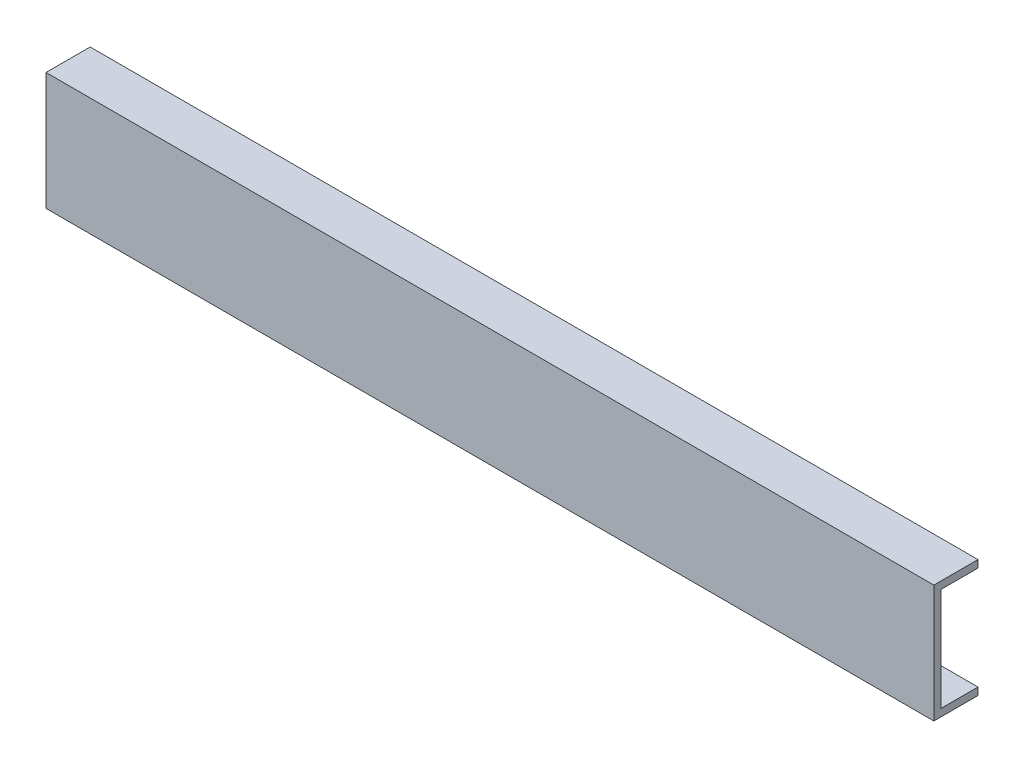
ISO-10303-21;
HEADER;
FILE_DESCRIPTION(('STEP AP214'),'2;1');
FILE_NAME('part.step','',(''),(''),'','','');
FILE_SCHEMA(('AUTOMOTIVE_DESIGN { 1 0 10303 214 1 1 1 1 }'));
ENDSEC;
DATA;
#1=APPLICATION_CONTEXT('core data for automotive mechanical design processes');
#2=APPLICATION_PROTOCOL_DEFINITION('international standard','automotive_design',2000,#1);
#3=PRODUCT_CONTEXT('',#1,'mechanical');
#4=PRODUCT('Part','Part','',(#3));
#5=PRODUCT_RELATED_PRODUCT_CATEGORY('part','',(#4));
#6=PRODUCT_DEFINITION_FORMATION('','',#4);
#7=PRODUCT_DEFINITION_CONTEXT('part definition',#1,'design');
#8=PRODUCT_DEFINITION('design','',#6,#7);
#9=PRODUCT_DEFINITION_SHAPE('','',#8);
#10=(LENGTH_UNIT() NAMED_UNIT(*) SI_UNIT(.MILLI.,.METRE.));
#11=(NAMED_UNIT(*) PLANE_ANGLE_UNIT() SI_UNIT($,.RADIAN.));
#12=(NAMED_UNIT(*) SI_UNIT($,.STERADIAN.) SOLID_ANGLE_UNIT());
#13=UNCERTAINTY_MEASURE_WITH_UNIT(LENGTH_MEASURE(1.E-05),#10,'distance_accuracy_value','');
#14=(GEOMETRIC_REPRESENTATION_CONTEXT(3) GLOBAL_UNCERTAINTY_ASSIGNED_CONTEXT((#13)) GLOBAL_UNIT_ASSIGNED_CONTEXT((#10,
#11,#12)) REPRESENTATION_CONTEXT('',''));
#15=CARTESIAN_POINT('',(0.,0.,0.));
#16=DIRECTION('',(0.,0.,1.));
#17=DIRECTION('',(1.,0.,0.));
#18=AXIS2_PLACEMENT_3D('',#15,#16,#17);
#19=CARTESIAN_POINT('',(603.25,-14.1624110638169,0.));
#20=DIRECTION('',(0.,0.,-1.));
#21=DIRECTION('',(-1.,0.,0.));
#22=AXIS2_PLACEMENT_3D('',#19,#20,#21);
#23=PLANE('',#22);
#24=DIRECTION('',(0.,-1.,0.));
#25=VECTOR('',#24,1.);
#26=CARTESIAN_POINT('',(0.,-14.1624110638169,0.));
#27=LINE('',#26,#25);
#28=CARTESIAN_POINT('',(0.,65.8375889361832,0.));
#29=VERTEX_POINT('',#28);
#30=CARTESIAN_POINT('',(0.,-14.1624110638169,0.));
#31=VERTEX_POINT('',#30);
#32=EDGE_CURVE('E129',#29,#31,#27,.T.);
#33=ORIENTED_EDGE('',*,*,#32,.T.);
#34=DIRECTION('',(-1.,0.,0.));
#35=VECTOR('',#34,1.);
#36=CARTESIAN_POINT('',(603.25,-14.1624110638169,0.));
#37=LINE('',#36,#35);
#38=CARTESIAN_POINT('',(603.25,-14.1624110638169,0.));
#39=VERTEX_POINT('',#38);
#40=EDGE_CURVE('E11',#39,#31,#37,.T.);
#41=ORIENTED_EDGE('',*,*,#40,.F.);
#42=DIRECTION('',(0.,-1.,0.));
#43=VECTOR('',#42,1.);
#44=CARTESIAN_POINT('',(603.25,-14.1624110638169,0.));
#45=LINE('',#44,#43);
#46=CARTESIAN_POINT('',(603.25,65.8375889361832,0.));
#47=VERTEX_POINT('',#46);
#48=EDGE_CURVE('E143',#47,#39,#45,.T.);
#49=ORIENTED_EDGE('',*,*,#48,.F.);
#50=DIRECTION('',(-1.,0.,0.));
#51=VECTOR('',#50,1.);
#52=CARTESIAN_POINT('',(603.25,65.8375889361832,0.));
#53=LINE('',#52,#51);
#54=EDGE_CURVE('E125',#47,#29,#53,.T.);
#55=ORIENTED_EDGE('',*,*,#54,.T.);
#56=EDGE_LOOP('',(#33,#41,#49,#55));
#57=FACE_BOUND('',#56,.T.);
#58=ADVANCED_FACE('F33',(#57),#23,.F.);
#59=CARTESIAN_POINT('',(603.25,-14.1624110638169,-30.));
#60=DIRECTION('',(0.,1.,0.));
#61=DIRECTION('',(0.,0.,1.));
#62=AXIS2_PLACEMENT_3D('',#59,#60,#61);
#63=PLANE('',#62);
#64=DIRECTION('',(0.,0.,-1.));
#65=VECTOR('',#64,1.);
#66=CARTESIAN_POINT('',(0.,-14.1624110638169,-30.));
#67=LINE('',#66,#65);
#68=CARTESIAN_POINT('',(0.,-14.1624110638169,-30.));
#69=VERTEX_POINT('',#68);
#70=EDGE_CURVE('E132',#31,#69,#67,.T.);
#71=ORIENTED_EDGE('',*,*,#70,.T.);
#72=DIRECTION('',(-1.,0.,0.));
#73=VECTOR('',#72,1.);
#74=CARTESIAN_POINT('',(603.25,-14.1624110638169,-30.));
#75=LINE('',#74,#73);
#76=CARTESIAN_POINT('',(603.25,-14.1624110638169,-30.));
#77=VERTEX_POINT('',#76);
#78=EDGE_CURVE('E41',#77,#69,#75,.T.);
#79=ORIENTED_EDGE('',*,*,#78,.F.);
#80=DIRECTION('',(0.,0.,-1.));
#81=VECTOR('',#80,1.);
#82=CARTESIAN_POINT('',(603.25,-14.1624110638169,-30.));
#83=LINE('',#82,#81);
#84=EDGE_CURVE('E92',#39,#77,#83,.T.);
#85=ORIENTED_EDGE('',*,*,#84,.F.);
#86=ORIENTED_EDGE('',*,*,#40,.T.);
#87=EDGE_LOOP('',(#71,#79,#85,#86));
#88=FACE_BOUND('',#87,.T.);
#89=ADVANCED_FACE('F178',(#88),#63,.F.);
#90=CARTESIAN_POINT('',(603.25,-9.16241106381685,-30.));
#91=DIRECTION('',(0.,0.,1.));
#92=DIRECTION('',(0.,-1.,0.));
#93=AXIS2_PLACEMENT_3D('',#90,#91,#92);
#94=PLANE('',#93);
#95=DIRECTION('',(0.,1.,0.));
#96=VECTOR('',#95,1.);
#97=CARTESIAN_POINT('',(0.,-9.16241106381685,-30.));
#98=LINE('',#97,#96);
#99=CARTESIAN_POINT('',(0.,-9.16241106381685,-30.));
#100=VERTEX_POINT('',#99);
#101=EDGE_CURVE('E134',#69,#100,#98,.T.);
#102=ORIENTED_EDGE('',*,*,#101,.T.);
#103=DIRECTION('',(-1.,0.,0.));
#104=VECTOR('',#103,1.);
#105=CARTESIAN_POINT('',(603.25,-9.16241106381685,-30.));
#106=LINE('',#105,#104);
#107=CARTESIAN_POINT('',(603.25,-9.16241106381685,-30.));
#108=VERTEX_POINT('',#107);
#109=EDGE_CURVE('E150',#108,#100,#106,.T.);
#110=ORIENTED_EDGE('',*,*,#109,.F.);
#111=DIRECTION('',(0.,1.,0.));
#112=VECTOR('',#111,1.);
#113=CARTESIAN_POINT('',(603.25,-9.16241106381685,-30.));
#114=LINE('',#113,#112);
#115=EDGE_CURVE('E158',#77,#108,#114,.T.);
#116=ORIENTED_EDGE('',*,*,#115,.F.);
#117=ORIENTED_EDGE('',*,*,#78,.T.);
#118=EDGE_LOOP('',(#102,#110,#116,#117));
#119=FACE_BOUND('',#118,.T.);
#120=ADVANCED_FACE('F156',(#119),#94,.F.);
#121=CARTESIAN_POINT('',(603.25,-9.16241106381686,-5.00000000000001));
#122=DIRECTION('',(0.,-1.,0.));
#123=DIRECTION('',(0.,0.,-1.));
#124=AXIS2_PLACEMENT_3D('',#121,#122,#123);
#125=PLANE('',#124);
#126=DIRECTION('',(0.,0.,1.));
#127=VECTOR('',#126,1.);
#128=CARTESIAN_POINT('',(0.,-9.16241106381686,-5.00000000000001));
#129=LINE('',#128,#127);
#130=CARTESIAN_POINT('',(0.,-9.16241106381686,-5.00000000000001));
#131=VERTEX_POINT('',#130);
#132=EDGE_CURVE('E136',#100,#131,#129,.T.);
#133=ORIENTED_EDGE('',*,*,#132,.T.);
#134=DIRECTION('',(-1.,0.,0.));
#135=VECTOR('',#134,1.);
#136=CARTESIAN_POINT('',(603.25,-9.16241106381686,-5.00000000000001));
#137=LINE('',#136,#135);
#138=CARTESIAN_POINT('',(603.25,-9.16241106381686,-5.00000000000001));
#139=VERTEX_POINT('',#138);
#140=EDGE_CURVE('E147',#139,#131,#137,.T.);
#141=ORIENTED_EDGE('',*,*,#140,.F.);
#142=DIRECTION('',(0.,0.,1.));
#143=VECTOR('',#142,1.);
#144=CARTESIAN_POINT('',(603.25,-9.16241106381686,-5.00000000000001));
#145=LINE('',#144,#143);
#146=EDGE_CURVE('E170',#108,#139,#145,.T.);
#147=ORIENTED_EDGE('',*,*,#146,.F.);
#148=ORIENTED_EDGE('',*,*,#109,.T.);
#149=EDGE_LOOP('',(#133,#141,#147,#148));
#150=FACE_BOUND('',#149,.T.);
#151=ADVANCED_FACE('F166',(#150),#125,.F.);
#152=CARTESIAN_POINT('',(603.25,60.8375889361832,-5.));
#153=DIRECTION('',(0.,0.,1.));
#154=DIRECTION('',(0.,-1.,0.));
#155=AXIS2_PLACEMENT_3D('',#152,#153,#154);
#156=PLANE('',#155);
#157=DIRECTION('',(0.,1.,0.));
#158=VECTOR('',#157,1.);
#159=CARTESIAN_POINT('',(0.,60.8375889361832,-5.));
#160=LINE('',#159,#158);
#161=CARTESIAN_POINT('',(0.,60.8375889361832,-5.));
#162=VERTEX_POINT('',#161);
#163=EDGE_CURVE('E138',#131,#162,#160,.T.);
#164=ORIENTED_EDGE('',*,*,#163,.T.);
#165=DIRECTION('',(-1.,0.,0.));
#166=VECTOR('',#165,1.);
#167=CARTESIAN_POINT('',(603.25,60.8375889361832,-5.));
#168=LINE('',#167,#166);
#169=CARTESIAN_POINT('',(603.25,60.8375889361832,-5.));
#170=VERTEX_POINT('',#169);
#171=EDGE_CURVE('E120',#170,#162,#168,.T.);
#172=ORIENTED_EDGE('',*,*,#171,.F.);
#173=DIRECTION('',(0.,1.,0.));
#174=VECTOR('',#173,1.);
#175=CARTESIAN_POINT('',(603.25,60.8375889361832,-5.));
#176=LINE('',#175,#174);
#177=EDGE_CURVE('E111',#139,#170,#176,.T.);
#178=ORIENTED_EDGE('',*,*,#177,.F.);
#179=ORIENTED_EDGE('',*,*,#140,.T.);
#180=EDGE_LOOP('',(#164,#172,#178,#179));
#181=FACE_BOUND('',#180,.T.);
#182=ADVANCED_FACE('F169',(#181),#156,.F.);
#183=CARTESIAN_POINT('',(603.25,60.8375889361832,-30.));
#184=DIRECTION('',(0.,1.,0.));
#185=DIRECTION('',(0.,0.,1.));
#186=AXIS2_PLACEMENT_3D('',#183,#184,#185);
#187=PLANE('',#186);
#188=DIRECTION('',(0.,0.,-1.));
#189=VECTOR('',#188,1.);
#190=CARTESIAN_POINT('',(0.,60.8375889361832,-30.));
#191=LINE('',#190,#189);
#192=CARTESIAN_POINT('',(0.,60.8375889361832,-30.));
#193=VERTEX_POINT('',#192);
#194=EDGE_CURVE('E119',#162,#193,#191,.T.);
#195=ORIENTED_EDGE('',*,*,#194,.T.);
#196=DIRECTION('',(-1.,0.,0.));
#197=VECTOR('',#196,1.);
#198=CARTESIAN_POINT('',(603.25,60.8375889361832,-30.));
#199=LINE('',#198,#197);
#200=CARTESIAN_POINT('',(603.25,60.8375889361832,-30.));
#201=VERTEX_POINT('',#200);
#202=EDGE_CURVE('E116',#201,#193,#199,.T.);
#203=ORIENTED_EDGE('',*,*,#202,.F.);
#204=DIRECTION('',(0.,0.,-1.));
#205=VECTOR('',#204,1.);
#206=CARTESIAN_POINT('',(603.25,60.8375889361832,-30.));
#207=LINE('',#206,#205);
#208=EDGE_CURVE('E105',#170,#201,#207,.T.);
#209=ORIENTED_EDGE('',*,*,#208,.F.);
#210=ORIENTED_EDGE('',*,*,#171,.T.);
#211=EDGE_LOOP('',(#195,#203,#209,#210));
#212=FACE_BOUND('',#211,.T.);
#213=ADVANCED_FACE('F117',(#212),#187,.F.);
#214=CARTESIAN_POINT('',(603.25,65.8375889361832,-30.));
#215=DIRECTION('',(0.,0.,1.));
#216=DIRECTION('',(1.,0.,0.));
#217=AXIS2_PLACEMENT_3D('',#214,#215,#216);
#218=PLANE('',#217);
#219=DIRECTION('',(0.,1.,0.));
#220=VECTOR('',#219,1.);
#221=CARTESIAN_POINT('',(0.,65.8375889361832,-30.));
#222=LINE('',#221,#220);
#223=CARTESIAN_POINT('',(0.,65.8375889361832,-30.));
#224=VERTEX_POINT('',#223);
#225=EDGE_CURVE('E78',#193,#224,#222,.T.);
#226=ORIENTED_EDGE('',*,*,#225,.T.);
#227=DIRECTION('',(-1.,0.,0.));
#228=VECTOR('',#227,1.);
#229=CARTESIAN_POINT('',(603.25,65.8375889361832,-30.));
#230=LINE('',#229,#228);
#231=CARTESIAN_POINT('',(603.25,65.8375889361832,-30.));
#232=VERTEX_POINT('',#231);
#233=EDGE_CURVE('E121',#232,#224,#230,.T.);
#234=ORIENTED_EDGE('',*,*,#233,.F.);
#235=DIRECTION('',(0.,1.,0.));
#236=VECTOR('',#235,1.);
#237=CARTESIAN_POINT('',(603.25,65.8375889361832,-30.));
#238=LINE('',#237,#236);
#239=EDGE_CURVE('E109',#201,#232,#238,.T.);
#240=ORIENTED_EDGE('',*,*,#239,.F.);
#241=ORIENTED_EDGE('',*,*,#202,.T.);
#242=EDGE_LOOP('',(#226,#234,#240,#241));
#243=FACE_BOUND('',#242,.T.);
#244=ADVANCED_FACE('F123',(#243),#218,.F.);
#245=CARTESIAN_POINT('',(603.25,65.8375889361832,0.));
#246=DIRECTION('',(0.,-1.,0.));
#247=DIRECTION('',(0.,0.,-1.));
#248=AXIS2_PLACEMENT_3D('',#245,#246,#247);
#249=PLANE('',#248);
#250=DIRECTION('',(0.,0.,1.));
#251=VECTOR('',#250,1.);
#252=CARTESIAN_POINT('',(0.,65.8375889361832,0.));
#253=LINE('',#252,#251);
#254=EDGE_CURVE('E84',#224,#29,#253,.T.);
#255=ORIENTED_EDGE('',*,*,#254,.T.);
#256=ORIENTED_EDGE('',*,*,#54,.F.);
#257=DIRECTION('',(0.,0.,1.));
#258=VECTOR('',#257,1.);
#259=CARTESIAN_POINT('',(603.25,65.8375889361832,0.));
#260=LINE('',#259,#258);
#261=EDGE_CURVE('E49',#232,#47,#260,.T.);
#262=ORIENTED_EDGE('',*,*,#261,.F.);
#263=ORIENTED_EDGE('',*,*,#233,.T.);
#264=EDGE_LOOP('',(#255,#256,#262,#263));
#265=FACE_BOUND('',#264,.T.);
#266=ADVANCED_FACE('F194',(#265),#249,.F.);
#267=CARTESIAN_POINT('',(603.25,0.,0.));
#268=DIRECTION('',(-1.,0.,0.));
#269=DIRECTION('',(0.,0.,1.));
#270=AXIS2_PLACEMENT_3D('',#267,#268,#269);
#271=PLANE('',#270);
#272=ORIENTED_EDGE('',*,*,#48,.T.);
#273=ORIENTED_EDGE('',*,*,#84,.T.);
#274=ORIENTED_EDGE('',*,*,#115,.T.);
#275=ORIENTED_EDGE('',*,*,#146,.T.);
#276=ORIENTED_EDGE('',*,*,#177,.T.);
#277=ORIENTED_EDGE('',*,*,#208,.T.);
#278=ORIENTED_EDGE('',*,*,#239,.T.);
#279=ORIENTED_EDGE('',*,*,#261,.T.);
#280=EDGE_LOOP('',(#272,#273,#274,#275,#276,#277,#278,#279));
#281=FACE_BOUND('',#280,.T.);
#282=ADVANCED_FACE('F107',(#281),#271,.F.);
#283=CARTESIAN_POINT('',(0.,0.,0.));
#284=DIRECTION('',(-1.,0.,0.));
#285=DIRECTION('',(0.,0.,1.));
#286=AXIS2_PLACEMENT_3D('',#283,#284,#285);
#287=PLANE('',#286);
#288=ORIENTED_EDGE('',*,*,#32,.F.);
#289=ORIENTED_EDGE('',*,*,#254,.F.);
#290=ORIENTED_EDGE('',*,*,#225,.F.);
#291=ORIENTED_EDGE('',*,*,#194,.F.);
#292=ORIENTED_EDGE('',*,*,#163,.F.);
#293=ORIENTED_EDGE('',*,*,#132,.F.);
#294=ORIENTED_EDGE('',*,*,#101,.F.);
#295=ORIENTED_EDGE('',*,*,#70,.F.);
#296=EDGE_LOOP('',(#288,#289,#290,#291,#292,#293,#294,#295));
#297=FACE_BOUND('',#296,.T.);
#298=ADVANCED_FACE('F162',(#297),#287,.T.);
#299=CLOSED_SHELL('',(#58,#89,#120,#151,#182,#213,#244,#266,#282,#298));
#300=MANIFOLD_SOLID_BREP('B2',#299);
#301=ADVANCED_BREP_SHAPE_REPRESENTATION('',(#18,#300),#14);
#302=SHAPE_DEFINITION_REPRESENTATION(#9,#301);
ENDSEC;
END-ISO-10303-21;
